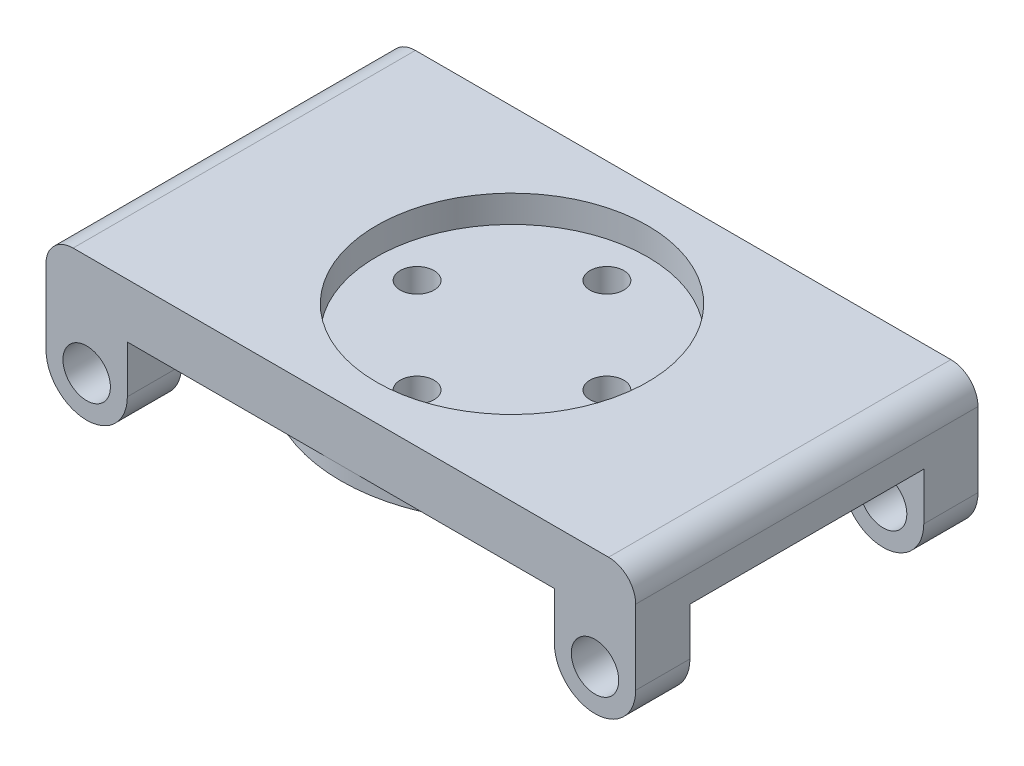
ISO-10303-21;
HEADER;
FILE_DESCRIPTION(('STEP AP214'),'2;1');
FILE_NAME('part.step','',(''),(''),'','','');
FILE_SCHEMA(('AUTOMOTIVE_DESIGN { 1 0 10303 214 1 1 1 1 }'));
ENDSEC;
DATA;
#1=APPLICATION_CONTEXT('core data for automotive mechanical design processes');
#2=APPLICATION_PROTOCOL_DEFINITION('international standard','automotive_design',2000,#1);
#3=PRODUCT_CONTEXT('',#1,'mechanical');
#4=PRODUCT('Part','Part','',(#3));
#5=PRODUCT_RELATED_PRODUCT_CATEGORY('part','',(#4));
#6=PRODUCT_DEFINITION_FORMATION('','',#4);
#7=PRODUCT_DEFINITION_CONTEXT('part definition',#1,'design');
#8=PRODUCT_DEFINITION('design','',#6,#7);
#9=PRODUCT_DEFINITION_SHAPE('','',#8);
#10=(LENGTH_UNIT() NAMED_UNIT(*) SI_UNIT(.MILLI.,.METRE.));
#11=(NAMED_UNIT(*) PLANE_ANGLE_UNIT() SI_UNIT($,.RADIAN.));
#12=(NAMED_UNIT(*) SI_UNIT($,.STERADIAN.) SOLID_ANGLE_UNIT());
#13=UNCERTAINTY_MEASURE_WITH_UNIT(LENGTH_MEASURE(1.E-05),#10,'distance_accuracy_value','');
#14=(GEOMETRIC_REPRESENTATION_CONTEXT(3) GLOBAL_UNCERTAINTY_ASSIGNED_CONTEXT((#13)) GLOBAL_UNIT_ASSIGNED_CONTEXT((#10,
#11,#12)) REPRESENTATION_CONTEXT('',''));
#15=CARTESIAN_POINT('',(0.,0.,0.));
#16=DIRECTION('',(0.,0.,1.));
#17=DIRECTION('',(1.,0.,0.));
#18=AXIS2_PLACEMENT_3D('',#15,#16,#17);
#19=CARTESIAN_POINT('',(0.,0.,0.));
#20=DIRECTION('',(0.,-1.,0.));
#21=DIRECTION('',(0.,0.,-1.));
#22=AXIS2_PLACEMENT_3D('',#19,#20,#21);
#23=PLANE('',#22);
#24=DIRECTION('',(1.,0.,0.));
#25=VECTOR('',#24,1.);
#26=CARTESIAN_POINT('',(0.,0.,-8.625));
#27=LINE('',#26,#25);
#28=CARTESIAN_POINT('',(-21.75,0.,-8.625));
#29=VERTEX_POINT('',#28);
#30=CARTESIAN_POINT('',(-15.75,0.,-8.625));
#31=VERTEX_POINT('',#30);
#32=EDGE_CURVE('E243',#29,#31,#27,.T.);
#33=ORIENTED_EDGE('',*,*,#32,.T.);
#34=DIRECTION('',(0.,0.,-1.));
#35=VECTOR('',#34,1.);
#36=CARTESIAN_POINT('',(-15.75,0.,-8.625));
#37=LINE('',#36,#35);
#38=CARTESIAN_POINT('',(-15.75,0.,-12.625));
#39=VERTEX_POINT('',#38);
#40=EDGE_CURVE('E253',#31,#39,#37,.T.);
#41=ORIENTED_EDGE('',*,*,#40,.T.);
#42=DIRECTION('',(-1.,0.,0.));
#43=VECTOR('',#42,1.);
#44=CARTESIAN_POINT('',(-21.75,0.,-12.625));
#45=LINE('',#44,#43);
#46=CARTESIAN_POINT('',(0.,0.,-12.625));
#47=VERTEX_POINT('',#46);
#48=EDGE_CURVE('E416',#47,#39,#45,.T.);
#49=ORIENTED_EDGE('',*,*,#48,.F.);
#50=CARTESIAN_POINT('',(0.,0.,0.));
#51=DIRECTION('',(0.,-1.,0.));
#52=DIRECTION('',(0.,0.,-1.));
#53=AXIS2_PLACEMENT_3D('',#50,#51,#52);
#54=CIRCLE('',#53,12.625);
#55=CARTESIAN_POINT('',(0.,0.,12.625));
#56=VERTEX_POINT('',#55);
#57=EDGE_CURVE('E394',#56,#47,#54,.T.);
#58=ORIENTED_EDGE('',*,*,#57,.F.);
#59=DIRECTION('',(1.,0.,0.));
#60=VECTOR('',#59,1.);
#61=CARTESIAN_POINT('',(-21.75,0.,12.625));
#62=LINE('',#61,#60);
#63=CARTESIAN_POINT('',(-15.75,0.,12.625));
#64=VERTEX_POINT('',#63);
#65=EDGE_CURVE('E408',#64,#56,#62,.T.);
#66=ORIENTED_EDGE('',*,*,#65,.F.);
#67=DIRECTION('',(0.,0.,1.));
#68=VECTOR('',#67,1.);
#69=CARTESIAN_POINT('',(-15.75,0.,8.625));
#70=LINE('',#69,#68);
#71=CARTESIAN_POINT('',(-15.75,0.,8.625));
#72=VERTEX_POINT('',#71);
#73=EDGE_CURVE('E343',#72,#64,#70,.T.);
#74=ORIENTED_EDGE('',*,*,#73,.F.);
#75=DIRECTION('',(1.,0.,0.));
#76=VECTOR('',#75,1.);
#77=CARTESIAN_POINT('',(0.,0.,8.625));
#78=LINE('',#77,#76);
#79=CARTESIAN_POINT('',(-21.75,0.,8.625));
#80=VERTEX_POINT('',#79);
#81=EDGE_CURVE('E330',#80,#72,#78,.T.);
#82=ORIENTED_EDGE('',*,*,#81,.F.);
#83=DIRECTION('',(0.,0.,1.));
#84=VECTOR('',#83,1.);
#85=CARTESIAN_POINT('',(-21.75,0.,12.625));
#86=LINE('',#85,#84);
#87=EDGE_CURVE('E420',#29,#80,#86,.T.);
#88=ORIENTED_EDGE('',*,*,#87,.F.);
#89=EDGE_LOOP('',(#33,#41,#49,#58,#66,#74,#82,#88));
#90=FACE_BOUND('',#89,.T.);
#91=ADVANCED_FACE('F47',(#90),#23,.T.);
#92=DIRECTION('',(0.,0.,-1.));
#93=VECTOR('',#92,1.);
#94=CARTESIAN_POINT('',(15.75,0.,-8.625));
#95=LINE('',#94,#93);
#96=CARTESIAN_POINT('',(15.75,0.,-8.625));
#97=VERTEX_POINT('',#96);
#98=CARTESIAN_POINT('',(15.75,0.,-12.625));
#99=VERTEX_POINT('',#98);
#100=EDGE_CURVE('E191',#97,#99,#95,.T.);
#101=ORIENTED_EDGE('',*,*,#100,.F.);
#102=DIRECTION('',(1.,0.,0.));
#103=VECTOR('',#102,1.);
#104=CARTESIAN_POINT('',(0.,0.,-8.625));
#105=LINE('',#104,#103);
#106=CARTESIAN_POINT('',(21.75,0.,-8.625));
#107=VERTEX_POINT('',#106);
#108=EDGE_CURVE('E201',#97,#107,#105,.T.);
#109=ORIENTED_EDGE('',*,*,#108,.T.);
#110=DIRECTION('',(0.,0.,-1.));
#111=VECTOR('',#110,1.);
#112=CARTESIAN_POINT('',(21.75,0.,12.625));
#113=LINE('',#112,#111);
#114=CARTESIAN_POINT('',(21.75,0.,8.625));
#115=VERTEX_POINT('',#114);
#116=EDGE_CURVE('E399',#115,#107,#113,.T.);
#117=ORIENTED_EDGE('',*,*,#116,.F.);
#118=DIRECTION('',(1.,0.,0.));
#119=VECTOR('',#118,1.);
#120=CARTESIAN_POINT('',(0.,0.,8.625));
#121=LINE('',#120,#119);
#122=CARTESIAN_POINT('',(15.75,0.,8.625));
#123=VERTEX_POINT('',#122);
#124=EDGE_CURVE('E281',#123,#115,#121,.T.);
#125=ORIENTED_EDGE('',*,*,#124,.F.);
#126=DIRECTION('',(0.,0.,1.));
#127=VECTOR('',#126,1.);
#128=CARTESIAN_POINT('',(15.75,0.,8.625));
#129=LINE('',#128,#127);
#130=CARTESIAN_POINT('',(15.75,0.,12.625));
#131=VERTEX_POINT('',#130);
#132=EDGE_CURVE('E306',#123,#131,#129,.T.);
#133=ORIENTED_EDGE('',*,*,#132,.T.);
#134=EDGE_CURVE('E423',#56,#131,#62,.T.);
#135=ORIENTED_EDGE('',*,*,#134,.F.);
#136=EDGE_CURVE('E385',#47,#56,#54,.T.);
#137=ORIENTED_EDGE('',*,*,#136,.F.);
#138=EDGE_CURVE('E417',#99,#47,#45,.T.);
#139=ORIENTED_EDGE('',*,*,#138,.F.);
#140=EDGE_LOOP('',(#101,#109,#117,#125,#133,#135,#137,#139));
#141=FACE_BOUND('',#140,.T.);
#142=ADVANCED_FACE('F475',(#141),#23,.T.);
#143=CARTESIAN_POINT('',(21.75,4.,12.625));
#144=DIRECTION('',(-1.,0.,0.));
#145=DIRECTION('',(0.,0.,1.));
#146=AXIS2_PLACEMENT_3D('',#143,#144,#145);
#147=PLANE('',#146);
#148=DIRECTION('',(0.,-1.,0.));
#149=VECTOR('',#148,1.);
#150=CARTESIAN_POINT('',(21.75,4.,-12.625));
#151=LINE('',#150,#149);
#152=CARTESIAN_POINT('',(21.75,2.,-12.625));
#153=VERTEX_POINT('',#152);
#154=CARTESIAN_POINT('',(21.75,-3.5,-12.625));
#155=VERTEX_POINT('',#154);
#156=EDGE_CURVE('E434',#153,#155,#151,.T.);
#157=ORIENTED_EDGE('',*,*,#156,.F.);
#158=DIRECTION('',(0.,0.,-1.));
#159=VECTOR('',#158,1.);
#160=CARTESIAN_POINT('',(21.75,2.,12.625));
#161=LINE('',#160,#159);
#162=CARTESIAN_POINT('',(21.75,2.,12.625));
#163=VERTEX_POINT('',#162);
#164=EDGE_CURVE('E71',#153,#163,#161,.F.);
#165=ORIENTED_EDGE('',*,*,#164,.T.);
#166=DIRECTION('',(0.,-1.,0.));
#167=VECTOR('',#166,1.);
#168=CARTESIAN_POINT('',(21.75,4.,12.625));
#169=LINE('',#168,#167);
#170=CARTESIAN_POINT('',(21.75,-3.5,12.625));
#171=VERTEX_POINT('',#170);
#172=EDGE_CURVE('E412',#163,#171,#169,.T.);
#173=ORIENTED_EDGE('',*,*,#172,.T.);
#174=DIRECTION('',(0.,0.,1.));
#175=VECTOR('',#174,1.);
#176=CARTESIAN_POINT('',(21.75,-3.5,8.625));
#177=LINE('',#176,#175);
#178=CARTESIAN_POINT('',(21.75,-3.5,8.625));
#179=VERTEX_POINT('',#178);
#180=EDGE_CURVE('E291',#179,#171,#177,.T.);
#181=ORIENTED_EDGE('',*,*,#180,.F.);
#182=DIRECTION('',(0.,-1.,0.));
#183=VECTOR('',#182,1.);
#184=CARTESIAN_POINT('',(21.75,0.,8.625));
#185=LINE('',#184,#183);
#186=EDGE_CURVE('E277',#115,#179,#185,.T.);
#187=ORIENTED_EDGE('',*,*,#186,.F.);
#188=ORIENTED_EDGE('',*,*,#116,.T.);
#189=DIRECTION('',(0.,-1.,0.));
#190=VECTOR('',#189,1.);
#191=CARTESIAN_POINT('',(21.75,0.,-8.625));
#192=LINE('',#191,#190);
#193=CARTESIAN_POINT('',(21.75,-3.5,-8.625));
#194=VERTEX_POINT('',#193);
#195=EDGE_CURVE('E218',#107,#194,#192,.T.);
#196=ORIENTED_EDGE('',*,*,#195,.T.);
#197=DIRECTION('',(0.,0.,-1.));
#198=VECTOR('',#197,1.);
#199=CARTESIAN_POINT('',(21.75,-3.5,-8.625));
#200=LINE('',#199,#198);
#201=EDGE_CURVE('E206',#194,#155,#200,.T.);
#202=ORIENTED_EDGE('',*,*,#201,.T.);
#203=EDGE_LOOP('',(#157,#165,#173,#181,#187,#188,#196,#202));
#204=FACE_BOUND('',#203,.T.);
#205=ADVANCED_FACE('F469',(#204),#147,.F.);
#206=CARTESIAN_POINT('',(-21.75,4.,-12.625));
#207=DIRECTION('',(0.,0.,1.));
#208=DIRECTION('',(1.,0.,0.));
#209=AXIS2_PLACEMENT_3D('',#206,#207,#208);
#210=PLANE('',#209);
#211=DIRECTION('',(-1.,0.,0.));
#212=VECTOR('',#211,1.);
#213=CARTESIAN_POINT('',(-21.75,4.,-12.625));
#214=LINE('',#213,#212);
#215=CARTESIAN_POINT('',(19.75,4.,-12.625));
#216=VERTEX_POINT('',#215);
#217=CARTESIAN_POINT('',(-19.75,4.,-12.625));
#218=VERTEX_POINT('',#217);
#219=EDGE_CURVE('E403',#216,#218,#214,.T.);
#220=ORIENTED_EDGE('',*,*,#219,.F.);
#221=CARTESIAN_POINT('',(19.75,2.,-12.625));
#222=DIRECTION('',(0.,0.,1.));
#223=DIRECTION('',(1.,0.,0.));
#224=AXIS2_PLACEMENT_3D('',#221,#222,#223);
#225=CIRCLE('',#224,2.);
#226=EDGE_CURVE('E448',#216,#153,#225,.F.);
#227=ORIENTED_EDGE('',*,*,#226,.T.);
#228=ORIENTED_EDGE('',*,*,#156,.T.);
#229=CARTESIAN_POINT('',(18.75,-3.5,-12.625));
#230=DIRECTION('',(0.,0.,1.));
#231=DIRECTION('',(1.,0.,0.));
#232=AXIS2_PLACEMENT_3D('',#229,#230,#231);
#233=CIRCLE('',#232,3.);
#234=CARTESIAN_POINT('',(15.75,-3.5,-12.625));
#235=VERTEX_POINT('',#234);
#236=EDGE_CURVE('E224',#155,#235,#233,.F.);
#237=ORIENTED_EDGE('',*,*,#236,.T.);
#238=DIRECTION('',(0.,1.,0.));
#239=VECTOR('',#238,1.);
#240=CARTESIAN_POINT('',(15.75,0.,-12.625));
#241=LINE('',#240,#239);
#242=EDGE_CURVE('E185',#235,#99,#241,.T.);
#243=ORIENTED_EDGE('',*,*,#242,.T.);
#244=ORIENTED_EDGE('',*,*,#138,.T.);
#245=ORIENTED_EDGE('',*,*,#48,.T.);
#246=DIRECTION('',(0.,1.,0.));
#247=VECTOR('',#246,1.);
#248=CARTESIAN_POINT('',(-15.75,0.,-12.625));
#249=LINE('',#248,#247);
#250=CARTESIAN_POINT('',(-15.75,-3.5,-12.625));
#251=VERTEX_POINT('',#250);
#252=EDGE_CURVE('E257',#251,#39,#249,.T.);
#253=ORIENTED_EDGE('',*,*,#252,.F.);
#254=CARTESIAN_POINT('',(-18.75,-3.5,-12.625));
#255=DIRECTION('',(0.,0.,1.));
#256=DIRECTION('',(1.,0.,0.));
#257=AXIS2_PLACEMENT_3D('',#254,#255,#256);
#258=CIRCLE('',#257,3.);
#259=CARTESIAN_POINT('',(-21.75,-3.5,-12.625));
#260=VERTEX_POINT('',#259);
#261=EDGE_CURVE('E239',#260,#251,#258,.T.);
#262=ORIENTED_EDGE('',*,*,#261,.F.);
#263=DIRECTION('',(0.,-1.,0.));
#264=VECTOR('',#263,1.);
#265=CARTESIAN_POINT('',(-21.75,4.,-12.625));
#266=LINE('',#265,#264);
#267=CARTESIAN_POINT('',(-21.75,2.,-12.625));
#268=VERTEX_POINT('',#267);
#269=EDGE_CURVE('E431',#268,#260,#266,.T.);
#270=ORIENTED_EDGE('',*,*,#269,.F.);
#271=CARTESIAN_POINT('',(-19.75,2.,-12.625));
#272=DIRECTION('',(0.,0.,1.));
#273=DIRECTION('',(1.,0.,0.));
#274=AXIS2_PLACEMENT_3D('',#271,#272,#273);
#275=CIRCLE('',#274,2.);
#276=EDGE_CURVE('E445',#268,#218,#275,.F.);
#277=ORIENTED_EDGE('',*,*,#276,.T.);
#278=EDGE_LOOP('',(#220,#227,#228,#237,#243,#244,#245,#253,#262,#270,#277));
#279=FACE_BOUND('',#278,.T.);
#280=CARTESIAN_POINT('',(-18.75,-3.5,-12.625));
#281=DIRECTION('',(0.,0.,1.));
#282=DIRECTION('',(1.,0.,0.));
#283=AXIS2_PLACEMENT_3D('',#280,#281,#282);
#284=CIRCLE('',#283,1.75);
#285=CARTESIAN_POINT('',(-17.,-3.5,-12.625));
#286=VERTEX_POINT('',#285);
#287=EDGE_CURVE('E231',#286,#286,#284,.T.);
#288=ORIENTED_EDGE('',*,*,#287,.T.);
#289=EDGE_LOOP('',(#288));
#290=FACE_BOUND('',#289,.T.);
#291=CARTESIAN_POINT('',(18.75,-3.5,-12.625));
#292=DIRECTION('',(0.,0.,1.));
#293=DIRECTION('',(1.,0.,0.));
#294=AXIS2_PLACEMENT_3D('',#291,#292,#293);
#295=CIRCLE('',#294,1.75);
#296=CARTESIAN_POINT('',(20.5,-3.5,-12.625));
#297=VERTEX_POINT('',#296);
#298=EDGE_CURVE('E208',#297,#297,#295,.F.);
#299=ORIENTED_EDGE('',*,*,#298,.F.);
#300=EDGE_LOOP('',(#299));
#301=FACE_BOUND('',#300,.T.);
#302=ADVANCED_FACE('F467',(#279,#290,#301),#210,.F.);
#303=CARTESIAN_POINT('',(-21.75,4.,12.625));
#304=DIRECTION('',(1.,0.,0.));
#305=DIRECTION('',(0.,0.,-1.));
#306=AXIS2_PLACEMENT_3D('',#303,#304,#305);
#307=PLANE('',#306);
#308=DIRECTION('',(0.,-1.,0.));
#309=VECTOR('',#308,1.);
#310=CARTESIAN_POINT('',(-21.75,4.,12.625));
#311=LINE('',#310,#309);
#312=CARTESIAN_POINT('',(-21.75,2.,12.625));
#313=VERTEX_POINT('',#312);
#314=CARTESIAN_POINT('',(-21.75,-3.5,12.625));
#315=VERTEX_POINT('',#314);
#316=EDGE_CURVE('E428',#313,#315,#311,.T.);
#317=ORIENTED_EDGE('',*,*,#316,.F.);
#318=DIRECTION('',(0.,0.,1.));
#319=VECTOR('',#318,1.);
#320=CARTESIAN_POINT('',(-21.75,2.,12.625));
#321=LINE('',#320,#319);
#322=EDGE_CURVE('E11',#313,#268,#321,.F.);
#323=ORIENTED_EDGE('',*,*,#322,.T.);
#324=ORIENTED_EDGE('',*,*,#269,.T.);
#325=DIRECTION('',(0.,0.,-1.));
#326=VECTOR('',#325,1.);
#327=CARTESIAN_POINT('',(-21.75,-3.5,-8.625));
#328=LINE('',#327,#326);
#329=CARTESIAN_POINT('',(-21.75,-3.5,-8.625));
#330=VERTEX_POINT('',#329);
#331=EDGE_CURVE('E262',#330,#260,#328,.T.);
#332=ORIENTED_EDGE('',*,*,#331,.F.);
#333=DIRECTION('',(0.,-1.,0.));
#334=VECTOR('',#333,1.);
#335=CARTESIAN_POINT('',(-21.75,0.,-8.625));
#336=LINE('',#335,#334);
#337=EDGE_CURVE('E238',#29,#330,#336,.T.);
#338=ORIENTED_EDGE('',*,*,#337,.F.);
#339=ORIENTED_EDGE('',*,*,#87,.T.);
#340=DIRECTION('',(0.,-1.,0.));
#341=VECTOR('',#340,1.);
#342=CARTESIAN_POINT('',(-21.75,0.,8.625));
#343=LINE('',#342,#341);
#344=CARTESIAN_POINT('',(-21.75,-3.5,8.625));
#345=VERTEX_POINT('',#344);
#346=EDGE_CURVE('E317',#80,#345,#343,.T.);
#347=ORIENTED_EDGE('',*,*,#346,.T.);
#348=DIRECTION('',(0.,0.,1.));
#349=VECTOR('',#348,1.);
#350=CARTESIAN_POINT('',(-21.75,-3.5,8.625));
#351=LINE('',#350,#349);
#352=EDGE_CURVE('E333',#345,#315,#351,.T.);
#353=ORIENTED_EDGE('',*,*,#352,.T.);
#354=EDGE_LOOP('',(#317,#323,#324,#332,#338,#339,#347,#353));
#355=FACE_BOUND('',#354,.T.);
#356=ADVANCED_FACE('F501',(#355),#307,.F.);
#357=CARTESIAN_POINT('',(-21.75,4.,12.625));
#358=DIRECTION('',(0.,0.,-1.));
#359=DIRECTION('',(-1.,0.,0.));
#360=AXIS2_PLACEMENT_3D('',#357,#358,#359);
#361=PLANE('',#360);
#362=ORIENTED_EDGE('',*,*,#172,.F.);
#363=CARTESIAN_POINT('',(19.75,2.,12.625));
#364=DIRECTION('',(0.,0.,-1.));
#365=DIRECTION('',(-1.,0.,0.));
#366=AXIS2_PLACEMENT_3D('',#363,#364,#365);
#367=CIRCLE('',#366,2.);
#368=CARTESIAN_POINT('',(19.75,4.,12.625));
#369=VERTEX_POINT('',#368);
#370=EDGE_CURVE('E56',#163,#369,#367,.F.);
#371=ORIENTED_EDGE('',*,*,#370,.T.);
#372=DIRECTION('',(1.,0.,0.));
#373=VECTOR('',#372,1.);
#374=CARTESIAN_POINT('',(-21.75,4.,12.625));
#375=LINE('',#374,#373);
#376=CARTESIAN_POINT('',(-19.75,4.,12.625));
#377=VERTEX_POINT('',#376);
#378=EDGE_CURVE('E407',#377,#369,#375,.T.);
#379=ORIENTED_EDGE('',*,*,#378,.F.);
#380=CARTESIAN_POINT('',(-19.75,2.,12.625));
#381=DIRECTION('',(0.,0.,-1.));
#382=DIRECTION('',(-1.,0.,0.));
#383=AXIS2_PLACEMENT_3D('',#380,#381,#382);
#384=CIRCLE('',#383,2.);
#385=EDGE_CURVE('E63',#377,#313,#384,.F.);
#386=ORIENTED_EDGE('',*,*,#385,.T.);
#387=ORIENTED_EDGE('',*,*,#316,.T.);
#388=CARTESIAN_POINT('',(-18.75,-3.5,12.625));
#389=DIRECTION('',(0.,0.,1.));
#390=DIRECTION('',(1.,0.,0.));
#391=AXIS2_PLACEMENT_3D('',#388,#389,#390);
#392=CIRCLE('',#391,3.);
#393=CARTESIAN_POINT('',(-15.75,-3.5,12.625));
#394=VERTEX_POINT('',#393);
#395=EDGE_CURVE('E337',#315,#394,#392,.T.);
#396=ORIENTED_EDGE('',*,*,#395,.T.);
#397=DIRECTION('',(0.,1.,0.));
#398=VECTOR('',#397,1.);
#399=CARTESIAN_POINT('',(-15.75,0.,12.625));
#400=LINE('',#399,#398);
#401=EDGE_CURVE('E318',#394,#64,#400,.T.);
#402=ORIENTED_EDGE('',*,*,#401,.T.);
#403=ORIENTED_EDGE('',*,*,#65,.T.);
#404=ORIENTED_EDGE('',*,*,#134,.T.);
#405=DIRECTION('',(0.,1.,0.));
#406=VECTOR('',#405,1.);
#407=CARTESIAN_POINT('',(15.75,0.,12.625));
#408=LINE('',#407,#406);
#409=CARTESIAN_POINT('',(15.75,-3.5,12.625));
#410=VERTEX_POINT('',#409);
#411=EDGE_CURVE('E295',#410,#131,#408,.T.);
#412=ORIENTED_EDGE('',*,*,#411,.F.);
#413=CARTESIAN_POINT('',(18.75,-3.5,12.625));
#414=DIRECTION('',(0.,0.,1.));
#415=DIRECTION('',(1.,0.,0.));
#416=AXIS2_PLACEMENT_3D('',#413,#414,#415);
#417=CIRCLE('',#416,3.);
#418=EDGE_CURVE('E266',#171,#410,#417,.F.);
#419=ORIENTED_EDGE('',*,*,#418,.F.);
#420=EDGE_LOOP('',(#362,#371,#379,#386,#387,#396,#402,#403,#404,#412,#419));
#421=FACE_BOUND('',#420,.T.);
#422=CARTESIAN_POINT('',(-18.75,-3.5,12.625));
#423=DIRECTION('',(0.,0.,1.));
#424=DIRECTION('',(1.,0.,0.));
#425=AXIS2_PLACEMENT_3D('',#422,#423,#424);
#426=CIRCLE('',#425,1.75);
#427=CARTESIAN_POINT('',(-17.,-3.5,12.625));
#428=VERTEX_POINT('',#427);
#429=EDGE_CURVE('E305',#428,#428,#426,.T.);
#430=ORIENTED_EDGE('',*,*,#429,.F.);
#431=EDGE_LOOP('',(#430));
#432=FACE_BOUND('',#431,.T.);
#433=CARTESIAN_POINT('',(18.75,-3.5,12.625));
#434=DIRECTION('',(0.,0.,1.));
#435=DIRECTION('',(1.,0.,0.));
#436=AXIS2_PLACEMENT_3D('',#433,#434,#435);
#437=CIRCLE('',#436,1.75);
#438=CARTESIAN_POINT('',(20.5,-3.5,12.625));
#439=VERTEX_POINT('',#438);
#440=EDGE_CURVE('E278',#439,#439,#437,.F.);
#441=ORIENTED_EDGE('',*,*,#440,.T.);
#442=EDGE_LOOP('',(#441));
#443=FACE_BOUND('',#442,.T.);
#444=ADVANCED_FACE('F456',(#421,#432,#443),#361,.F.);
#445=CARTESIAN_POINT('',(0.,4.,0.));
#446=DIRECTION('',(0.,-1.,0.));
#447=DIRECTION('',(0.,0.,-1.));
#448=AXIS2_PLACEMENT_3D('',#445,#446,#447);
#449=PLANE('',#448);
#450=CARTESIAN_POINT('',(0.,4.,0.));
#451=DIRECTION('',(0.,1.,0.));
#452=DIRECTION('',(0.,0.,1.));
#453=AXIS2_PLACEMENT_3D('',#450,#451,#452);
#454=CIRCLE('',#453,10.);
#455=CARTESIAN_POINT('',(0.,4.,10.));
#456=VERTEX_POINT('',#455);
#457=EDGE_CURVE('E390',#456,#456,#454,.T.);
#458=ORIENTED_EDGE('',*,*,#457,.F.);
#459=EDGE_LOOP('',(#458));
#460=FACE_BOUND('',#459,.T.);
#461=ORIENTED_EDGE('',*,*,#378,.T.);
#462=DIRECTION('',(0.,0.,-1.));
#463=VECTOR('',#462,1.);
#464=CARTESIAN_POINT('',(19.75,4.,0.));
#465=LINE('',#464,#463);
#466=EDGE_CURVE('E441',#369,#216,#465,.T.);
#467=ORIENTED_EDGE('',*,*,#466,.T.);
#468=ORIENTED_EDGE('',*,*,#219,.T.);
#469=DIRECTION('',(0.,0.,1.));
#470=VECTOR('',#469,1.);
#471=CARTESIAN_POINT('',(-19.75,4.,0.));
#472=LINE('',#471,#470);
#473=EDGE_CURVE('E437',#218,#377,#472,.T.);
#474=ORIENTED_EDGE('',*,*,#473,.T.);
#475=EDGE_LOOP('',(#461,#467,#468,#474));
#476=FACE_BOUND('',#475,.T.);
#477=ADVANCED_FACE('F462',(#460,#476),#449,.F.);
#478=CARTESIAN_POINT('',(0.,2.,0.));
#479=DIRECTION('',(0.,1.,0.));
#480=DIRECTION('',(0.,0.,1.));
#481=AXIS2_PLACEMENT_3D('',#478,#479,#480);
#482=CYLINDRICAL_SURFACE('',#481,10.);
#483=CARTESIAN_POINT('',(0.,2.,0.));
#484=DIRECTION('',(0.,1.,0.));
#485=DIRECTION('',(0.,0.,1.));
#486=AXIS2_PLACEMENT_3D('',#483,#484,#485);
#487=CIRCLE('',#486,10.);
#488=CARTESIAN_POINT('',(0.,2.,10.));
#489=VERTEX_POINT('',#488);
#490=EDGE_CURVE('E395',#489,#489,#487,.T.);
#491=ORIENTED_EDGE('',*,*,#490,.F.);
#492=EDGE_LOOP('',(#491));
#493=FACE_BOUND('',#492,.T.);
#494=ORIENTED_EDGE('',*,*,#457,.T.);
#495=EDGE_LOOP('',(#494));
#496=FACE_BOUND('',#495,.T.);
#497=ADVANCED_FACE('F619',(#493,#496),#482,.F.);
#498=CARTESIAN_POINT('',(0.,2.,0.));
#499=DIRECTION('',(0.,1.,0.));
#500=DIRECTION('',(0.,0.,1.));
#501=AXIS2_PLACEMENT_3D('',#498,#499,#500);
#502=PLANE('',#501);
#503=CARTESIAN_POINT('',(0.,2.,-7.));
#504=DIRECTION('',(0.,1.,0.));
#505=DIRECTION('',(0.,0.,1.));
#506=AXIS2_PLACEMENT_3D('',#503,#504,#505);
#507=CIRCLE('',#506,1.25);
#508=CARTESIAN_POINT('',(0.,2.,-5.75));
#509=VERTEX_POINT('',#508);
#510=EDGE_CURVE('E381',#509,#509,#507,.T.);
#511=ORIENTED_EDGE('',*,*,#510,.F.);
#512=EDGE_LOOP('',(#511));
#513=FACE_BOUND('',#512,.T.);
#514=CARTESIAN_POINT('',(7.,2.,0.));
#515=DIRECTION('',(0.,1.,0.));
#516=DIRECTION('',(0.,0.,1.));
#517=AXIS2_PLACEMENT_3D('',#514,#515,#516);
#518=CIRCLE('',#517,1.25);
#519=CARTESIAN_POINT('',(7.,2.,1.25000000000002));
#520=VERTEX_POINT('',#519);
#521=EDGE_CURVE('E377',#520,#520,#518,.T.);
#522=ORIENTED_EDGE('',*,*,#521,.F.);
#523=EDGE_LOOP('',(#522));
#524=FACE_BOUND('',#523,.T.);
#525=CARTESIAN_POINT('',(0.,2.,7.));
#526=DIRECTION('',(0.,1.,0.));
#527=DIRECTION('',(0.,0.,1.));
#528=AXIS2_PLACEMENT_3D('',#525,#526,#527);
#529=CIRCLE('',#528,1.25);
#530=CARTESIAN_POINT('',(0.,2.,8.25));
#531=VERTEX_POINT('',#530);
#532=EDGE_CURVE('E373',#531,#531,#529,.T.);
#533=ORIENTED_EDGE('',*,*,#532,.F.);
#534=EDGE_LOOP('',(#533));
#535=FACE_BOUND('',#534,.T.);
#536=CARTESIAN_POINT('',(-7.,2.,0.));
#537=DIRECTION('',(0.,1.,0.));
#538=DIRECTION('',(0.,0.,1.));
#539=AXIS2_PLACEMENT_3D('',#536,#537,#538);
#540=CIRCLE('',#539,1.25);
#541=CARTESIAN_POINT('',(-7.,2.,1.24999999999993));
#542=VERTEX_POINT('',#541);
#543=EDGE_CURVE('E358',#542,#542,#540,.T.);
#544=ORIENTED_EDGE('',*,*,#543,.F.);
#545=EDGE_LOOP('',(#544));
#546=FACE_BOUND('',#545,.T.);
#547=ORIENTED_EDGE('',*,*,#490,.T.);
#548=EDGE_LOOP('',(#547));
#549=FACE_BOUND('',#548,.T.);
#550=ADVANCED_FACE('F616',(#513,#524,#535,#546,#549),#502,.T.);
#551=CARTESIAN_POINT('',(0.,-1.,0.));
#552=DIRECTION('',(0.,1.,0.));
#553=DIRECTION('',(0.,0.,1.));
#554=AXIS2_PLACEMENT_3D('',#551,#552,#553);
#555=CYLINDRICAL_SURFACE('',#554,12.625);
#556=CARTESIAN_POINT('',(0.,-1.,0.));
#557=DIRECTION('',(0.,-1.,0.));
#558=DIRECTION('',(0.,0.,-1.));
#559=AXIS2_PLACEMENT_3D('',#556,#557,#558);
#560=CIRCLE('',#559,12.625);
#561=CARTESIAN_POINT('',(0.,-1.,-12.625));
#562=VERTEX_POINT('',#561);
#563=EDGE_CURVE('E386',#562,#562,#560,.T.);
#564=ORIENTED_EDGE('',*,*,#563,.F.);
#565=EDGE_LOOP('',(#564));
#566=FACE_BOUND('',#565,.T.);
#567=ORIENTED_EDGE('',*,*,#136,.T.);
#568=ORIENTED_EDGE('',*,*,#57,.T.);
#569=EDGE_LOOP('',(#567,#568));
#570=FACE_BOUND('',#569,.T.);
#571=ADVANCED_FACE('F481',(#566,#570),#555,.T.);
#572=CARTESIAN_POINT('',(0.,-1.,0.));
#573=DIRECTION('',(0.,-1.,0.));
#574=DIRECTION('',(0.,0.,-1.));
#575=AXIS2_PLACEMENT_3D('',#572,#573,#574);
#576=PLANE('',#575);
#577=CARTESIAN_POINT('',(0.,-1.,-7.));
#578=DIRECTION('',(0.,1.,0.));
#579=DIRECTION('',(0.,0.,1.));
#580=AXIS2_PLACEMENT_3D('',#577,#578,#579);
#581=CIRCLE('',#580,1.25);
#582=CARTESIAN_POINT('',(0.,-1.,-5.75));
#583=VERTEX_POINT('',#582);
#584=EDGE_CURVE('E354',#583,#583,#581,.T.);
#585=ORIENTED_EDGE('',*,*,#584,.T.);
#586=EDGE_LOOP('',(#585));
#587=FACE_BOUND('',#586,.T.);
#588=CARTESIAN_POINT('',(7.,-1.,0.));
#589=DIRECTION('',(0.,1.,0.));
#590=DIRECTION('',(0.,0.,1.));
#591=AXIS2_PLACEMENT_3D('',#588,#589,#590);
#592=CIRCLE('',#591,1.25);
#593=CARTESIAN_POINT('',(7.,-1.,1.25000000000002));
#594=VERTEX_POINT('',#593);
#595=EDGE_CURVE('E359',#594,#594,#592,.T.);
#596=ORIENTED_EDGE('',*,*,#595,.T.);
#597=EDGE_LOOP('',(#596));
#598=FACE_BOUND('',#597,.T.);
#599=CARTESIAN_POINT('',(0.,-1.,7.));
#600=DIRECTION('',(0.,1.,0.));
#601=DIRECTION('',(0.,0.,1.));
#602=AXIS2_PLACEMENT_3D('',#599,#600,#601);
#603=CIRCLE('',#602,1.25);
#604=CARTESIAN_POINT('',(0.,-1.,8.25));
#605=VERTEX_POINT('',#604);
#606=EDGE_CURVE('E363',#605,#605,#603,.T.);
#607=ORIENTED_EDGE('',*,*,#606,.T.);
#608=EDGE_LOOP('',(#607));
#609=FACE_BOUND('',#608,.T.);
#610=CARTESIAN_POINT('',(-7.,-1.,0.));
#611=DIRECTION('',(0.,1.,0.));
#612=DIRECTION('',(0.,0.,1.));
#613=AXIS2_PLACEMENT_3D('',#610,#611,#612);
#614=CIRCLE('',#613,1.25);
#615=CARTESIAN_POINT('',(-7.,-1.,1.24999999999993));
#616=VERTEX_POINT('',#615);
#617=EDGE_CURVE('E347',#616,#616,#614,.T.);
#618=ORIENTED_EDGE('',*,*,#617,.T.);
#619=EDGE_LOOP('',(#618));
#620=FACE_BOUND('',#619,.T.);
#621=ORIENTED_EDGE('',*,*,#563,.T.);
#622=EDGE_LOOP('',(#621));
#623=FACE_BOUND('',#622,.T.);
#624=ADVANCED_FACE('F609',(#587,#598,#609,#620,#623),#576,.T.);
#625=CARTESIAN_POINT('',(-7.,-1.,0.));
#626=DIRECTION('',(0.,1.,0.));
#627=DIRECTION('',(0.,0.,1.));
#628=AXIS2_PLACEMENT_3D('',#625,#626,#627);
#629=CYLINDRICAL_SURFACE('',#628,1.25);
#630=ORIENTED_EDGE('',*,*,#543,.T.);
#631=EDGE_LOOP('',(#630));
#632=FACE_BOUND('',#631,.T.);
#633=ORIENTED_EDGE('',*,*,#617,.F.);
#634=EDGE_LOOP('',(#633));
#635=FACE_BOUND('',#634,.T.);
#636=ADVANCED_FACE('F605',(#632,#635),#629,.F.);
#637=CARTESIAN_POINT('',(0.,-1.,7.));
#638=DIRECTION('',(0.,1.,0.));
#639=DIRECTION('',(0.,0.,1.));
#640=AXIS2_PLACEMENT_3D('',#637,#638,#639);
#641=CYLINDRICAL_SURFACE('',#640,1.25);
#642=ORIENTED_EDGE('',*,*,#532,.T.);
#643=EDGE_LOOP('',(#642));
#644=FACE_BOUND('',#643,.T.);
#645=ORIENTED_EDGE('',*,*,#606,.F.);
#646=EDGE_LOOP('',(#645));
#647=FACE_BOUND('',#646,.T.);
#648=ADVANCED_FACE('F601',(#644,#647),#641,.F.);
#649=CARTESIAN_POINT('',(7.,-1.,0.));
#650=DIRECTION('',(0.,1.,0.));
#651=DIRECTION('',(0.,0.,1.));
#652=AXIS2_PLACEMENT_3D('',#649,#650,#651);
#653=CYLINDRICAL_SURFACE('',#652,1.25);
#654=ORIENTED_EDGE('',*,*,#521,.T.);
#655=EDGE_LOOP('',(#654));
#656=FACE_BOUND('',#655,.T.);
#657=ORIENTED_EDGE('',*,*,#595,.F.);
#658=EDGE_LOOP('',(#657));
#659=FACE_BOUND('',#658,.T.);
#660=ADVANCED_FACE('F597',(#656,#659),#653,.F.);
#661=CARTESIAN_POINT('',(0.,-1.,-7.));
#662=DIRECTION('',(0.,1.,0.));
#663=DIRECTION('',(0.,0.,1.));
#664=AXIS2_PLACEMENT_3D('',#661,#662,#663);
#665=CYLINDRICAL_SURFACE('',#664,1.25);
#666=ORIENTED_EDGE('',*,*,#510,.T.);
#667=EDGE_LOOP('',(#666));
#668=FACE_BOUND('',#667,.T.);
#669=ORIENTED_EDGE('',*,*,#584,.F.);
#670=EDGE_LOOP('',(#669));
#671=FACE_BOUND('',#670,.T.);
#672=ADVANCED_FACE('F588',(#668,#671),#665,.F.);
#673=CARTESIAN_POINT('',(-15.75,0.,8.625));
#674=DIRECTION('',(1.,0.,0.));
#675=DIRECTION('',(0.,1.,0.));
#676=AXIS2_PLACEMENT_3D('',#673,#674,#675);
#677=PLANE('',#676);
#678=ORIENTED_EDGE('',*,*,#401,.F.);
#679=DIRECTION('',(0.,0.,1.));
#680=VECTOR('',#679,1.);
#681=CARTESIAN_POINT('',(-15.75,-3.5,8.625));
#682=LINE('',#681,#680);
#683=CARTESIAN_POINT('',(-15.75,-3.5,8.625));
#684=VERTEX_POINT('',#683);
#685=EDGE_CURVE('E348',#684,#394,#682,.T.);
#686=ORIENTED_EDGE('',*,*,#685,.F.);
#687=DIRECTION('',(0.,1.,0.));
#688=VECTOR('',#687,1.);
#689=CARTESIAN_POINT('',(-15.75,0.,8.625));
#690=LINE('',#689,#688);
#691=EDGE_CURVE('E326',#684,#72,#690,.T.);
#692=ORIENTED_EDGE('',*,*,#691,.T.);
#693=ORIENTED_EDGE('',*,*,#73,.T.);
#694=EDGE_LOOP('',(#678,#686,#692,#693));
#695=FACE_BOUND('',#694,.T.);
#696=ADVANCED_FACE('F492',(#695),#677,.T.);
#697=CARTESIAN_POINT('',(-18.75,-3.5,8.625));
#698=DIRECTION('',(0.,0.,1.));
#699=DIRECTION('',(1.,0.,0.));
#700=AXIS2_PLACEMENT_3D('',#697,#698,#699);
#701=CYLINDRICAL_SURFACE('',#700,1.75);
#702=CARTESIAN_POINT('',(-18.75,-3.5,8.625));
#703=DIRECTION('',(0.,0.,1.));
#704=DIRECTION('',(1.,0.,0.));
#705=AXIS2_PLACEMENT_3D('',#702,#703,#704);
#706=CIRCLE('',#705,1.75);
#707=CARTESIAN_POINT('',(-17.,-3.5,8.625));
#708=VERTEX_POINT('',#707);
#709=EDGE_CURVE('E313',#708,#708,#706,.T.);
#710=ORIENTED_EDGE('',*,*,#709,.F.);
#711=EDGE_LOOP('',(#710));
#712=FACE_BOUND('',#711,.T.);
#713=ORIENTED_EDGE('',*,*,#429,.T.);
#714=EDGE_LOOP('',(#713));
#715=FACE_BOUND('',#714,.T.);
#716=ADVANCED_FACE('F587',(#712,#715),#701,.F.);
#717=CARTESIAN_POINT('',(-18.75,-3.5,8.625));
#718=DIRECTION('',(0.,0.,1.));
#719=DIRECTION('',(1.,0.,0.));
#720=AXIS2_PLACEMENT_3D('',#717,#718,#719);
#721=CYLINDRICAL_SURFACE('',#720,3.);
#722=ORIENTED_EDGE('',*,*,#395,.F.);
#723=ORIENTED_EDGE('',*,*,#352,.F.);
#724=CARTESIAN_POINT('',(-18.75,-3.5,8.625));
#725=DIRECTION('',(0.,0.,1.));
#726=DIRECTION('',(1.,0.,0.));
#727=AXIS2_PLACEMENT_3D('',#724,#725,#726);
#728=CIRCLE('',#727,3.);
#729=EDGE_CURVE('E322',#345,#684,#728,.T.);
#730=ORIENTED_EDGE('',*,*,#729,.T.);
#731=ORIENTED_EDGE('',*,*,#685,.T.);
#732=EDGE_LOOP('',(#722,#723,#730,#731));
#733=FACE_BOUND('',#732,.T.);
#734=ADVANCED_FACE('F583',(#733),#721,.T.);
#735=CARTESIAN_POINT('',(0.,0.,8.625));
#736=DIRECTION('',(0.,0.,1.));
#737=DIRECTION('',(1.,0.,0.));
#738=AXIS2_PLACEMENT_3D('',#735,#736,#737);
#739=PLANE('',#738);
#740=ORIENTED_EDGE('',*,*,#709,.T.);
#741=EDGE_LOOP('',(#740));
#742=FACE_BOUND('',#741,.T.);
#743=ORIENTED_EDGE('',*,*,#346,.F.);
#744=ORIENTED_EDGE('',*,*,#81,.T.);
#745=ORIENTED_EDGE('',*,*,#691,.F.);
#746=ORIENTED_EDGE('',*,*,#729,.F.);
#747=EDGE_LOOP('',(#743,#744,#745,#746));
#748=FACE_BOUND('',#747,.T.);
#749=ADVANCED_FACE('F498',(#742,#748),#739,.F.);
#750=CARTESIAN_POINT('',(18.75,-3.5,8.625));
#751=DIRECTION('',(0.,0.,1.));
#752=DIRECTION('',(1.,0.,0.));
#753=AXIS2_PLACEMENT_3D('',#750,#751,#752);
#754=CYLINDRICAL_SURFACE('',#753,3.);
#755=ORIENTED_EDGE('',*,*,#418,.T.);
#756=DIRECTION('',(0.,0.,1.));
#757=VECTOR('',#756,1.);
#758=CARTESIAN_POINT('',(15.75,-3.5,8.625));
#759=LINE('',#758,#757);
#760=CARTESIAN_POINT('',(15.75,-3.5,8.625));
#761=VERTEX_POINT('',#760);
#762=EDGE_CURVE('E301',#761,#410,#759,.T.);
#763=ORIENTED_EDGE('',*,*,#762,.F.);
#764=CARTESIAN_POINT('',(18.75,-3.5,8.625));
#765=DIRECTION('',(0.,0.,1.));
#766=DIRECTION('',(1.,0.,0.));
#767=AXIS2_PLACEMENT_3D('',#764,#765,#766);
#768=CIRCLE('',#767,3.);
#769=EDGE_CURVE('E274',#179,#761,#768,.F.);
#770=ORIENTED_EDGE('',*,*,#769,.F.);
#771=ORIENTED_EDGE('',*,*,#180,.T.);
#772=EDGE_LOOP('',(#755,#763,#770,#771));
#773=FACE_BOUND('',#772,.T.);
#774=ADVANCED_FACE('F576',(#773),#754,.T.);
#775=CARTESIAN_POINT('',(15.75,0.,8.625));
#776=DIRECTION('',(1.,0.,0.));
#777=DIRECTION('',(0.,1.,0.));
#778=AXIS2_PLACEMENT_3D('',#775,#776,#777);
#779=PLANE('',#778);
#780=ORIENTED_EDGE('',*,*,#411,.T.);
#781=ORIENTED_EDGE('',*,*,#132,.F.);
#782=DIRECTION('',(0.,1.,0.));
#783=VECTOR('',#782,1.);
#784=CARTESIAN_POINT('',(15.75,0.,8.625));
#785=LINE('',#784,#783);
#786=EDGE_CURVE('E284',#761,#123,#785,.T.);
#787=ORIENTED_EDGE('',*,*,#786,.F.);
#788=ORIENTED_EDGE('',*,*,#762,.T.);
#789=EDGE_LOOP('',(#780,#781,#787,#788));
#790=FACE_BOUND('',#789,.T.);
#791=ADVANCED_FACE('F572',(#790),#779,.F.);
#792=CARTESIAN_POINT('',(18.75,-3.5,8.625));
#793=DIRECTION('',(0.,0.,1.));
#794=DIRECTION('',(1.,0.,0.));
#795=AXIS2_PLACEMENT_3D('',#792,#793,#794);
#796=CYLINDRICAL_SURFACE('',#795,1.75);
#797=CARTESIAN_POINT('',(18.75,-3.5,8.625));
#798=DIRECTION('',(0.,0.,1.));
#799=DIRECTION('',(1.,0.,0.));
#800=AXIS2_PLACEMENT_3D('',#797,#798,#799);
#801=CIRCLE('',#800,1.75);
#802=CARTESIAN_POINT('',(20.5,-3.5,8.625));
#803=VERTEX_POINT('',#802);
#804=EDGE_CURVE('E287',#803,#803,#801,.F.);
#805=ORIENTED_EDGE('',*,*,#804,.T.);
#806=EDGE_LOOP('',(#805));
#807=FACE_BOUND('',#806,.T.);
#808=ORIENTED_EDGE('',*,*,#440,.F.);
#809=EDGE_LOOP('',(#808));
#810=FACE_BOUND('',#809,.T.);
#811=ADVANCED_FACE('F523',(#807,#810),#796,.F.);
#812=CARTESIAN_POINT('',(0.,0.,8.625));
#813=DIRECTION('',(0.,0.,1.));
#814=DIRECTION('',(1.,0.,0.));
#815=AXIS2_PLACEMENT_3D('',#812,#813,#814);
#816=PLANE('',#815);
#817=ORIENTED_EDGE('',*,*,#769,.T.);
#818=ORIENTED_EDGE('',*,*,#786,.T.);
#819=ORIENTED_EDGE('',*,*,#124,.T.);
#820=ORIENTED_EDGE('',*,*,#186,.T.);
#821=EDGE_LOOP('',(#817,#818,#819,#820));
#822=FACE_BOUND('',#821,.T.);
#823=ORIENTED_EDGE('',*,*,#804,.F.);
#824=EDGE_LOOP('',(#823));
#825=FACE_BOUND('',#824,.T.);
#826=ADVANCED_FACE('F516',(#822,#825),#816,.F.);
#827=CARTESIAN_POINT('',(-18.75,-3.5,-8.625));
#828=DIRECTION('',(0.,0.,-1.));
#829=DIRECTION('',(-1.,0.,0.));
#830=AXIS2_PLACEMENT_3D('',#827,#828,#829);
#831=CYLINDRICAL_SURFACE('',#830,3.);
#832=ORIENTED_EDGE('',*,*,#261,.T.);
#833=DIRECTION('',(0.,0.,-1.));
#834=VECTOR('',#833,1.);
#835=CARTESIAN_POINT('',(-15.75,-3.5,-8.625));
#836=LINE('',#835,#834);
#837=CARTESIAN_POINT('',(-15.75,-3.5,-8.625));
#838=VERTEX_POINT('',#837);
#839=EDGE_CURVE('E267',#838,#251,#836,.T.);
#840=ORIENTED_EDGE('',*,*,#839,.F.);
#841=CARTESIAN_POINT('',(-18.75,-3.5,-8.625));
#842=DIRECTION('',(0.,0.,1.));
#843=DIRECTION('',(1.,0.,0.));
#844=AXIS2_PLACEMENT_3D('',#841,#842,#843);
#845=CIRCLE('',#844,3.);
#846=EDGE_CURVE('E250',#330,#838,#845,.T.);
#847=ORIENTED_EDGE('',*,*,#846,.F.);
#848=ORIENTED_EDGE('',*,*,#331,.T.);
#849=EDGE_LOOP('',(#832,#840,#847,#848));
#850=FACE_BOUND('',#849,.T.);
#851=ADVANCED_FACE('F514',(#850),#831,.T.);
#852=CARTESIAN_POINT('',(-15.75,0.,-8.625));
#853=DIRECTION('',(-1.,0.,0.));
#854=DIRECTION('',(0.,-1.,0.));
#855=AXIS2_PLACEMENT_3D('',#852,#853,#854);
#856=PLANE('',#855);
#857=ORIENTED_EDGE('',*,*,#252,.T.);
#858=ORIENTED_EDGE('',*,*,#40,.F.);
#859=DIRECTION('',(0.,1.,0.));
#860=VECTOR('',#859,1.);
#861=CARTESIAN_POINT('',(-15.75,0.,-8.625));
#862=LINE('',#861,#860);
#863=EDGE_CURVE('E247',#838,#31,#862,.T.);
#864=ORIENTED_EDGE('',*,*,#863,.F.);
#865=ORIENTED_EDGE('',*,*,#839,.T.);
#866=EDGE_LOOP('',(#857,#858,#864,#865));
#867=FACE_BOUND('',#866,.T.);
#868=ADVANCED_FACE('F509',(#867),#856,.F.);
#869=CARTESIAN_POINT('',(-18.75,-3.5,-8.625));
#870=DIRECTION('',(0.,0.,-1.));
#871=DIRECTION('',(-1.,0.,0.));
#872=AXIS2_PLACEMENT_3D('',#869,#870,#871);
#873=CYLINDRICAL_SURFACE('',#872,1.75);
#874=CARTESIAN_POINT('',(-18.75,-3.5,-8.625));
#875=DIRECTION('',(0.,0.,1.));
#876=DIRECTION('',(1.,0.,0.));
#877=AXIS2_PLACEMENT_3D('',#874,#875,#876);
#878=CIRCLE('',#877,1.75);
#879=CARTESIAN_POINT('',(-17.,-3.5,-8.625));
#880=VERTEX_POINT('',#879);
#881=EDGE_CURVE('E234',#880,#880,#878,.T.);
#882=ORIENTED_EDGE('',*,*,#881,.T.);
#883=EDGE_LOOP('',(#882));
#884=FACE_BOUND('',#883,.T.);
#885=ORIENTED_EDGE('',*,*,#287,.F.);
#886=EDGE_LOOP('',(#885));
#887=FACE_BOUND('',#886,.T.);
#888=ADVANCED_FACE('F521',(#884,#887),#873,.F.);
#889=CARTESIAN_POINT('',(0.,0.,-8.625));
#890=DIRECTION('',(0.,0.,-1.));
#891=DIRECTION('',(1.,0.,0.));
#892=AXIS2_PLACEMENT_3D('',#889,#890,#891);
#893=PLANE('',#892);
#894=ORIENTED_EDGE('',*,*,#881,.F.);
#895=EDGE_LOOP('',(#894));
#896=FACE_BOUND('',#895,.T.);
#897=ORIENTED_EDGE('',*,*,#337,.T.);
#898=ORIENTED_EDGE('',*,*,#846,.T.);
#899=ORIENTED_EDGE('',*,*,#863,.T.);
#900=ORIENTED_EDGE('',*,*,#32,.F.);
#901=EDGE_LOOP('',(#897,#898,#899,#900));
#902=FACE_BOUND('',#901,.T.);
#903=ADVANCED_FACE('F505',(#896,#902),#893,.F.);
#904=CARTESIAN_POINT('',(18.75,-3.5,-8.625));
#905=DIRECTION('',(0.,0.,-1.));
#906=DIRECTION('',(-1.,0.,0.));
#907=AXIS2_PLACEMENT_3D('',#904,#905,#906);
#908=CYLINDRICAL_SURFACE('',#907,3.);
#909=ORIENTED_EDGE('',*,*,#236,.F.);
#910=ORIENTED_EDGE('',*,*,#201,.F.);
#911=CARTESIAN_POINT('',(18.75,-3.5,-8.625));
#912=DIRECTION('',(0.,0.,1.));
#913=DIRECTION('',(1.,0.,0.));
#914=AXIS2_PLACEMENT_3D('',#911,#912,#913);
#915=CIRCLE('',#914,3.);
#916=CARTESIAN_POINT('',(15.75,-3.5,-8.625));
#917=VERTEX_POINT('',#916);
#918=EDGE_CURVE('E198',#194,#917,#915,.F.);
#919=ORIENTED_EDGE('',*,*,#918,.T.);
#920=DIRECTION('',(0.,0.,-1.));
#921=VECTOR('',#920,1.);
#922=CARTESIAN_POINT('',(15.75,-3.5,-8.625));
#923=LINE('',#922,#921);
#924=EDGE_CURVE('E179',#917,#235,#923,.T.);
#925=ORIENTED_EDGE('',*,*,#924,.T.);
#926=EDGE_LOOP('',(#909,#910,#919,#925));
#927=FACE_BOUND('',#926,.T.);
#928=ADVANCED_FACE('F204',(#927),#908,.T.);
#929=CARTESIAN_POINT('',(15.75,0.,-8.625));
#930=DIRECTION('',(-1.,0.,0.));
#931=DIRECTION('',(0.,-1.,0.));
#932=AXIS2_PLACEMENT_3D('',#929,#930,#931);
#933=PLANE('',#932);
#934=ORIENTED_EDGE('',*,*,#242,.F.);
#935=ORIENTED_EDGE('',*,*,#924,.F.);
#936=DIRECTION('',(0.,1.,0.));
#937=VECTOR('',#936,1.);
#938=CARTESIAN_POINT('',(15.75,0.,-8.625));
#939=LINE('',#938,#937);
#940=EDGE_CURVE('E183',#917,#97,#939,.T.);
#941=ORIENTED_EDGE('',*,*,#940,.T.);
#942=ORIENTED_EDGE('',*,*,#100,.T.);
#943=EDGE_LOOP('',(#934,#935,#941,#942));
#944=FACE_BOUND('',#943,.T.);
#945=ADVANCED_FACE('F181',(#944),#933,.T.);
#946=CARTESIAN_POINT('',(18.75,-3.5,-8.625));
#947=DIRECTION('',(0.,0.,-1.));
#948=DIRECTION('',(-1.,0.,0.));
#949=AXIS2_PLACEMENT_3D('',#946,#947,#948);
#950=CYLINDRICAL_SURFACE('',#949,1.75);
#951=CARTESIAN_POINT('',(18.75,-3.5,-8.625));
#952=DIRECTION('',(0.,0.,1.));
#953=DIRECTION('',(1.,0.,0.));
#954=AXIS2_PLACEMENT_3D('',#951,#952,#953);
#955=CIRCLE('',#954,1.75);
#956=CARTESIAN_POINT('',(20.5,-3.5,-8.625));
#957=VERTEX_POINT('',#956);
#958=EDGE_CURVE('E192',#957,#957,#955,.F.);
#959=ORIENTED_EDGE('',*,*,#958,.F.);
#960=EDGE_LOOP('',(#959));
#961=FACE_BOUND('',#960,.T.);
#962=ORIENTED_EDGE('',*,*,#298,.T.);
#963=EDGE_LOOP('',(#962));
#964=FACE_BOUND('',#963,.T.);
#965=ADVANCED_FACE('F546',(#961,#964),#950,.F.);
#966=CARTESIAN_POINT('',(0.,0.,-8.625));
#967=DIRECTION('',(0.,0.,-1.));
#968=DIRECTION('',(1.,0.,0.));
#969=AXIS2_PLACEMENT_3D('',#966,#967,#968);
#970=PLANE('',#969);
#971=ORIENTED_EDGE('',*,*,#918,.F.);
#972=ORIENTED_EDGE('',*,*,#195,.F.);
#973=ORIENTED_EDGE('',*,*,#108,.F.);
#974=ORIENTED_EDGE('',*,*,#940,.F.);
#975=EDGE_LOOP('',(#971,#972,#973,#974));
#976=FACE_BOUND('',#975,.T.);
#977=ORIENTED_EDGE('',*,*,#958,.T.);
#978=EDGE_LOOP('',(#977));
#979=FACE_BOUND('',#978,.T.);
#980=ADVANCED_FACE('F196',(#976,#979),#970,.F.);
#981=CARTESIAN_POINT('',(19.75,2.,0.));
#982=DIRECTION('',(0.,0.,-1.));
#983=DIRECTION('',(-1.,0.,0.));
#984=AXIS2_PLACEMENT_3D('',#981,#982,#983);
#985=CYLINDRICAL_SURFACE('',#984,2.);
#986=ORIENTED_EDGE('',*,*,#370,.F.);
#987=ORIENTED_EDGE('',*,*,#164,.F.);
#988=ORIENTED_EDGE('',*,*,#226,.F.);
#989=ORIENTED_EDGE('',*,*,#466,.F.);
#990=EDGE_LOOP('',(#986,#987,#988,#989));
#991=FACE_BOUND('',#990,.T.);
#992=ADVANCED_FACE('F465',(#991),#985,.T.);
#993=CARTESIAN_POINT('',(-19.75,2.,0.));
#994=DIRECTION('',(0.,0.,1.));
#995=DIRECTION('',(1.,0.,0.));
#996=AXIS2_PLACEMENT_3D('',#993,#994,#995);
#997=CYLINDRICAL_SURFACE('',#996,2.);
#998=ORIENTED_EDGE('',*,*,#276,.F.);
#999=ORIENTED_EDGE('',*,*,#322,.F.);
#1000=ORIENTED_EDGE('',*,*,#385,.F.);
#1001=ORIENTED_EDGE('',*,*,#473,.F.);
#1002=EDGE_LOOP('',(#998,#999,#1000,#1001));
#1003=FACE_BOUND('',#1002,.T.);
#1004=ADVANCED_FACE('F49',(#1003),#997,.T.);
#1005=CLOSED_SHELL('',(#91,#142,#205,#302,#356,#444,#477,#497,#550,#571,#624,#636,#648,#660,
#672,#696,#716,#734,#749,#774,#791,#811,#826,#851,#868,#888,#903,#928,#945,#965,#980,#992,#1004));
#1006=MANIFOLD_SOLID_BREP('B2',#1005);
#1007=ADVANCED_BREP_SHAPE_REPRESENTATION('',(#18,#1006),#14);
#1008=SHAPE_DEFINITION_REPRESENTATION(#9,#1007);
ENDSEC;
END-ISO-10303-21;
